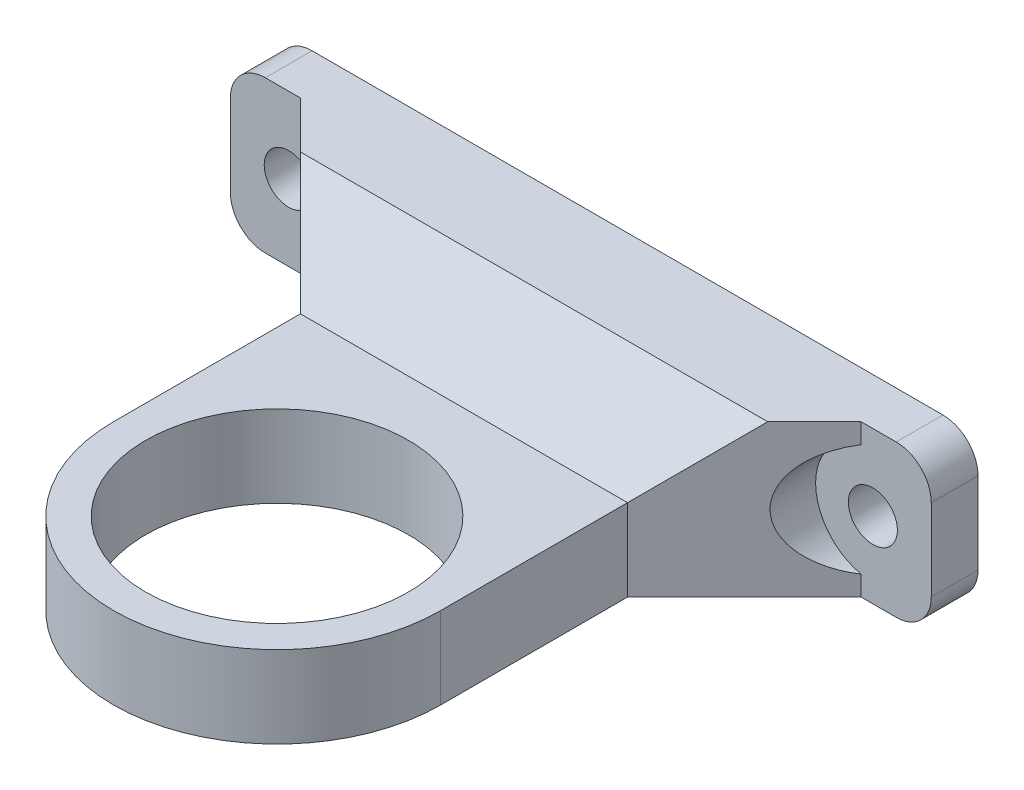
ISO-10303-21;
HEADER;
FILE_DESCRIPTION(('STEP AP214'),'2;1');
FILE_NAME('part.step','',(''),(''),'','','');
FILE_SCHEMA(('AUTOMOTIVE_DESIGN { 1 0 10303 214 1 1 1 1 }'));
ENDSEC;
DATA;
#1=APPLICATION_CONTEXT('core data for automotive mechanical design processes');
#2=APPLICATION_PROTOCOL_DEFINITION('international standard','automotive_design',2000,#1);
#3=PRODUCT_CONTEXT('',#1,'mechanical');
#4=PRODUCT('Part','Part','',(#3));
#5=PRODUCT_RELATED_PRODUCT_CATEGORY('part','',(#4));
#6=PRODUCT_DEFINITION_FORMATION('','',#4);
#7=PRODUCT_DEFINITION_CONTEXT('part definition',#1,'design');
#8=PRODUCT_DEFINITION('design','',#6,#7);
#9=PRODUCT_DEFINITION_SHAPE('','',#8);
#10=(LENGTH_UNIT() NAMED_UNIT(*) SI_UNIT(.MILLI.,.METRE.));
#11=(NAMED_UNIT(*) PLANE_ANGLE_UNIT() SI_UNIT($,.RADIAN.));
#12=(NAMED_UNIT(*) SI_UNIT($,.STERADIAN.) SOLID_ANGLE_UNIT());
#13=UNCERTAINTY_MEASURE_WITH_UNIT(LENGTH_MEASURE(1.E-05),#10,'distance_accuracy_value','');
#14=(GEOMETRIC_REPRESENTATION_CONTEXT(3) GLOBAL_UNCERTAINTY_ASSIGNED_CONTEXT((#13)) GLOBAL_UNIT_ASSIGNED_CONTEXT((#10,
#11,#12)) REPRESENTATION_CONTEXT('',''));
#15=CARTESIAN_POINT('',(0.,0.,0.));
#16=DIRECTION('',(0.,0.,1.));
#17=DIRECTION('',(1.,0.,0.));
#18=AXIS2_PLACEMENT_3D('',#15,#16,#17);
#19=CARTESIAN_POINT('',(25.,3.,-22.));
#20=DIRECTION('',(0.,0.,1.));
#21=DIRECTION('',(1.,0.,0.));
#22=AXIS2_PLACEMENT_3D('',#19,#20,#21);
#23=CYLINDRICAL_SURFACE('',#22,2.1);
#24=CARTESIAN_POINT('',(25.,3.,-22.));
#25=DIRECTION('',(0.,0.,-1.));
#26=DIRECTION('',(-1.,0.,0.));
#27=AXIS2_PLACEMENT_3D('',#24,#25,#26);
#28=CIRCLE('',#27,2.1);
#29=CARTESIAN_POINT('',(22.9,3.,-22.));
#30=VERTEX_POINT('',#29);
#31=EDGE_CURVE('E158',#30,#30,#28,.T.);
#32=ORIENTED_EDGE('',*,*,#31,.T.);
#33=EDGE_LOOP('',(#32));
#34=FACE_BOUND('',#33,.T.);
#35=CARTESIAN_POINT('',(25.,3.,-18.));
#36=DIRECTION('',(0.,0.,-1.));
#37=DIRECTION('',(-1.,0.,0.));
#38=AXIS2_PLACEMENT_3D('',#35,#36,#37);
#39=CIRCLE('',#38,2.1);
#40=CARTESIAN_POINT('',(22.9,3.,-18.));
#41=VERTEX_POINT('',#40);
#42=EDGE_CURVE('E305',#41,#41,#39,.F.);
#43=ORIENTED_EDGE('',*,*,#42,.T.);
#44=EDGE_LOOP('',(#43));
#45=FACE_BOUND('',#44,.T.);
#46=ADVANCED_FACE('F34',(#34,#45),#23,.F.);
#47=CARTESIAN_POINT('',(-14.,3.5,-7.99999999999993));
#48=DIRECTION('',(0.707106781186551,0.,-0.707106781186544));
#49=DIRECTION('',(0.,-1.,0.));
#50=AXIS2_PLACEMENT_3D('',#47,#48,#49);
#51=PLANE('',#50);
#52=CARTESIAN_POINT('',(-25.,3.,-19.0000000000001));
#53=DIRECTION('',(0.707106781186551,0.,-0.707106781186544));
#54=DIRECTION('',(-0.707106781186544,0.,-0.707106781186551));
#55=AXIS2_PLACEMENT_3D('',#52,#53,#54);
#56=ELLIPSE('',#55,6.9296464556282,4.9);
#57=CARTESIAN_POINT('',(-24.,-1.79687398208458,-18.));
#58=VERTEX_POINT('',#57);
#59=CARTESIAN_POINT('',(-24.,7.79687398208458,-18.));
#60=VERTEX_POINT('',#59);
#61=EDGE_CURVE('E168',#58,#60,#56,.F.);
#62=ORIENTED_EDGE('',*,*,#61,.F.);
#63=DIRECTION('',(0.,1.,0.));
#64=VECTOR('',#63,1.);
#65=CARTESIAN_POINT('',(-24.,3.5,-18.));
#66=LINE('',#65,#64);
#67=CARTESIAN_POINT('',(-24.,-3.5,-18.));
#68=VERTEX_POINT('',#67);
#69=EDGE_CURVE('E179',#68,#58,#66,.T.);
#70=ORIENTED_EDGE('',*,*,#69,.F.);
#71=DIRECTION('',(-0.707106781186544,0.,-0.707106781186551));
#72=VECTOR('',#71,1.);
#73=CARTESIAN_POINT('',(-3.0000000000001,-3.5,3.00000000000007));
#74=LINE('',#73,#72);
#75=CARTESIAN_POINT('',(-14.,-3.5,-7.99999999999993));
#76=VERTEX_POINT('',#75);
#77=EDGE_CURVE('E189',#76,#68,#74,.T.);
#78=ORIENTED_EDGE('',*,*,#77,.F.);
#79=DIRECTION('',(0.,-1.,0.));
#80=VECTOR('',#79,1.);
#81=CARTESIAN_POINT('',(-14.,3.5,-7.99999999999993));
#82=LINE('',#81,#80);
#83=CARTESIAN_POINT('',(-14.,3.5,-7.99999999999993));
#84=VERTEX_POINT('',#83);
#85=EDGE_CURVE('E181',#84,#76,#82,.T.);
#86=ORIENTED_EDGE('',*,*,#85,.F.);
#87=DIRECTION('',(-0.57735026918962,0.577350269189632,-0.577350269189626));
#88=VECTOR('',#87,1.);
#89=CARTESIAN_POINT('',(-14.,3.5,-7.99999999999993));
#90=LINE('',#89,#88);
#91=CARTESIAN_POINT('',(-19.9999999999999,9.5,-13.9999999999999));
#92=VERTEX_POINT('',#91);
#93=EDGE_CURVE('E201',#84,#92,#90,.T.);
#94=ORIENTED_EDGE('',*,*,#93,.T.);
#95=DIRECTION('',(0.707106781186544,0.,0.707106781186551));
#96=VECTOR('',#95,1.);
#97=CARTESIAN_POINT('',(-14.,9.5,-7.99999999999993));
#98=LINE('',#97,#96);
#99=CARTESIAN_POINT('',(-24.,9.5,-18.));
#100=VERTEX_POINT('',#99);
#101=EDGE_CURVE('E203',#100,#92,#98,.T.);
#102=ORIENTED_EDGE('',*,*,#101,.F.);
#103=EDGE_CURVE('E176',#60,#100,#66,.T.);
#104=ORIENTED_EDGE('',*,*,#103,.F.);
#105=EDGE_LOOP('',(#62,#70,#78,#86,#94,#102,#104));
#106=FACE_BOUND('',#105,.T.);
#107=ADVANCED_FACE('F353',(#106),#51,.F.);
#108=CARTESIAN_POINT('',(-25.,3.,-22.));
#109=DIRECTION('',(0.,0.,1.));
#110=DIRECTION('',(1.,0.,0.));
#111=AXIS2_PLACEMENT_3D('',#108,#109,#110);
#112=CYLINDRICAL_SURFACE('',#111,2.1);
#113=CARTESIAN_POINT('',(-25.,3.,-22.));
#114=DIRECTION('',(0.,0.,1.));
#115=DIRECTION('',(1.,0.,0.));
#116=AXIS2_PLACEMENT_3D('',#113,#114,#115);
#117=CIRCLE('',#116,2.1);
#118=CARTESIAN_POINT('',(-22.9,3.,-22.));
#119=VERTEX_POINT('',#118);
#120=EDGE_CURVE('E299',#119,#119,#117,.T.);
#121=ORIENTED_EDGE('',*,*,#120,.F.);
#122=EDGE_LOOP('',(#121));
#123=FACE_BOUND('',#122,.T.);
#124=CARTESIAN_POINT('',(-25.,3.,-18.));
#125=DIRECTION('',(0.,0.,-1.));
#126=DIRECTION('',(-1.,0.,0.));
#127=AXIS2_PLACEMENT_3D('',#124,#125,#126);
#128=CIRCLE('',#127,2.1);
#129=CARTESIAN_POINT('',(-27.1,3.,-18.));
#130=VERTEX_POINT('',#129);
#131=EDGE_CURVE('E296',#130,#130,#128,.T.);
#132=ORIENTED_EDGE('',*,*,#131,.F.);
#133=EDGE_LOOP('',(#132));
#134=FACE_BOUND('',#133,.T.);
#135=ADVANCED_FACE('F383',(#123,#134),#112,.F.);
#136=CARTESIAN_POINT('',(0.,3.5,-18.));
#137=DIRECTION('',(0.,0.,-1.));
#138=DIRECTION('',(-1.,0.,0.));
#139=AXIS2_PLACEMENT_3D('',#136,#137,#138);
#140=PLANE('',#139);
#141=DIRECTION('',(1.,0.,0.));
#142=VECTOR('',#141,1.);
#143=CARTESIAN_POINT('',(0.,-3.5,-18.));
#144=LINE('',#143,#142);
#145=CARTESIAN_POINT('',(24.0000000000001,-3.5,-18.));
#146=VERTEX_POINT('',#145);
#147=CARTESIAN_POINT('',(27.,-3.5,-18.));
#148=VERTEX_POINT('',#147);
#149=EDGE_CURVE('E271',#146,#148,#144,.T.);
#150=ORIENTED_EDGE('',*,*,#149,.T.);
#151=CARTESIAN_POINT('',(27.,-0.5,-18.));
#152=DIRECTION('',(0.,0.,-1.));
#153=DIRECTION('',(-1.,0.,0.));
#154=AXIS2_PLACEMENT_3D('',#151,#152,#153);
#155=CIRCLE('',#154,3.);
#156=CARTESIAN_POINT('',(30.,-0.5,-18.));
#157=VERTEX_POINT('',#156);
#158=EDGE_CURVE('E215',#148,#157,#155,.F.);
#159=ORIENTED_EDGE('',*,*,#158,.T.);
#160=DIRECTION('',(0.,-1.,0.));
#161=VECTOR('',#160,1.);
#162=CARTESIAN_POINT('',(30.,3.5,-18.));
#163=LINE('',#162,#161);
#164=CARTESIAN_POINT('',(30.,6.5,-18.));
#165=VERTEX_POINT('',#164);
#166=EDGE_CURVE('E256',#165,#157,#163,.T.);
#167=ORIENTED_EDGE('',*,*,#166,.F.);
#168=CARTESIAN_POINT('',(27.,6.5,-18.));
#169=DIRECTION('',(0.,0.,-1.));
#170=DIRECTION('',(-1.,0.,0.));
#171=AXIS2_PLACEMENT_3D('',#168,#169,#170);
#172=CIRCLE('',#171,3.);
#173=CARTESIAN_POINT('',(27.,9.5,-18.));
#174=VERTEX_POINT('',#173);
#175=EDGE_CURVE('E213',#165,#174,#172,.F.);
#176=ORIENTED_EDGE('',*,*,#175,.T.);
#177=DIRECTION('',(1.,0.,0.));
#178=VECTOR('',#177,1.);
#179=CARTESIAN_POINT('',(-30.,9.5,-18.));
#180=LINE('',#179,#178);
#181=CARTESIAN_POINT('',(24.0000000000001,9.5,-18.));
#182=VERTEX_POINT('',#181);
#183=EDGE_CURVE('E175',#182,#174,#180,.T.);
#184=ORIENTED_EDGE('',*,*,#183,.F.);
#185=DIRECTION('',(0.,-1.,0.));
#186=VECTOR('',#185,1.);
#187=CARTESIAN_POINT('',(24.0000000000001,-3.5,-18.));
#188=LINE('',#187,#186);
#189=CARTESIAN_POINT('',(24.0000000000001,7.7968739820846,-18.));
#190=VERTEX_POINT('',#189);
#191=EDGE_CURVE('E163',#182,#190,#188,.T.);
#192=ORIENTED_EDGE('',*,*,#191,.T.);
#193=CARTESIAN_POINT('',(25.,3.,-18.));
#194=DIRECTION('',(0.,0.,-1.));
#195=DIRECTION('',(-1.,0.,0.));
#196=AXIS2_PLACEMENT_3D('',#193,#194,#195);
#197=CIRCLE('',#196,4.9);
#198=CARTESIAN_POINT('',(24.0000000000001,-1.7968739820846,-18.));
#199=VERTEX_POINT('',#198);
#200=EDGE_CURVE('E151',#199,#190,#197,.T.);
#201=ORIENTED_EDGE('',*,*,#200,.F.);
#202=EDGE_CURVE('E166',#199,#146,#188,.T.);
#203=ORIENTED_EDGE('',*,*,#202,.T.);
#204=EDGE_LOOP('',(#150,#159,#167,#176,#184,#192,#201,#203));
#205=FACE_BOUND('',#204,.T.);
#206=ORIENTED_EDGE('',*,*,#42,.F.);
#207=EDGE_LOOP('',(#206));
#208=FACE_BOUND('',#207,.T.);
#209=ADVANCED_FACE('F172',(#205,#208),#140,.F.);
#210=CARTESIAN_POINT('',(-30.,3.5,0.));
#211=DIRECTION('',(1.,0.,0.));
#212=DIRECTION('',(0.,0.,-1.));
#213=AXIS2_PLACEMENT_3D('',#210,#211,#212);
#214=PLANE('',#213);
#215=DIRECTION('',(0.,-1.,0.));
#216=VECTOR('',#215,1.);
#217=CARTESIAN_POINT('',(-30.,3.5,-22.));
#218=LINE('',#217,#216);
#219=CARTESIAN_POINT('',(-30.,6.5,-22.));
#220=VERTEX_POINT('',#219);
#221=CARTESIAN_POINT('',(-30.,-0.5,-22.));
#222=VERTEX_POINT('',#221);
#223=EDGE_CURVE('E244',#220,#222,#218,.T.);
#224=ORIENTED_EDGE('',*,*,#223,.T.);
#225=DIRECTION('',(0.,0.,1.));
#226=VECTOR('',#225,1.);
#227=CARTESIAN_POINT('',(-30.,-0.5,0.));
#228=LINE('',#227,#226);
#229=CARTESIAN_POINT('',(-30.,-0.5,-18.));
#230=VERTEX_POINT('',#229);
#231=EDGE_CURVE('E237',#222,#230,#228,.T.);
#232=ORIENTED_EDGE('',*,*,#231,.T.);
#233=DIRECTION('',(0.,-1.,0.));
#234=VECTOR('',#233,1.);
#235=CARTESIAN_POINT('',(-30.,3.5,-18.));
#236=LINE('',#235,#234);
#237=CARTESIAN_POINT('',(-30.,6.5,-18.));
#238=VERTEX_POINT('',#237);
#239=EDGE_CURVE('E241',#238,#230,#236,.T.);
#240=ORIENTED_EDGE('',*,*,#239,.F.);
#241=DIRECTION('',(0.,0.,1.));
#242=VECTOR('',#241,1.);
#243=CARTESIAN_POINT('',(-30.,6.5,-22.));
#244=LINE('',#243,#242);
#245=EDGE_CURVE('E235',#238,#220,#244,.F.);
#246=ORIENTED_EDGE('',*,*,#245,.T.);
#247=EDGE_LOOP('',(#224,#232,#240,#246));
#248=FACE_BOUND('',#247,.T.);
#249=ADVANCED_FACE('F240',(#248),#214,.F.);
#250=CARTESIAN_POINT('',(-14.,3.5,0.));
#251=DIRECTION('',(-1.,0.,0.));
#252=DIRECTION('',(0.,0.,1.));
#253=AXIS2_PLACEMENT_3D('',#250,#251,#252);
#254=PLANE('',#253);
#255=DIRECTION('',(0.,0.,-1.));
#256=VECTOR('',#255,1.);
#257=CARTESIAN_POINT('',(-14.,3.5,0.));
#258=LINE('',#257,#256);
#259=CARTESIAN_POINT('',(-14.,3.5,7.99999999999999));
#260=VERTEX_POINT('',#259);
#261=EDGE_CURVE('E267',#260,#84,#258,.T.);
#262=ORIENTED_EDGE('',*,*,#261,.T.);
#263=ORIENTED_EDGE('',*,*,#85,.T.);
#264=DIRECTION('',(0.,0.,-1.));
#265=VECTOR('',#264,1.);
#266=CARTESIAN_POINT('',(-14.,-3.5,0.));
#267=LINE('',#266,#265);
#268=CARTESIAN_POINT('',(-14.,-3.5,7.99999999999999));
#269=VERTEX_POINT('',#268);
#270=EDGE_CURVE('E277',#269,#76,#267,.T.);
#271=ORIENTED_EDGE('',*,*,#270,.F.);
#272=DIRECTION('',(0.,-1.,0.));
#273=VECTOR('',#272,1.);
#274=CARTESIAN_POINT('',(-14.,3.5,7.99999999999999));
#275=LINE('',#274,#273);
#276=EDGE_CURVE('E249',#260,#269,#275,.T.);
#277=ORIENTED_EDGE('',*,*,#276,.F.);
#278=EDGE_LOOP('',(#262,#263,#271,#277));
#279=FACE_BOUND('',#278,.T.);
#280=ADVANCED_FACE('F349',(#279),#254,.T.);
#281=CARTESIAN_POINT('',(0.,3.5,7.99999999999999));
#282=DIRECTION('',(0.,-1.,0.));
#283=DIRECTION('',(0.,0.,-1.));
#284=AXIS2_PLACEMENT_3D('',#281,#282,#283);
#285=CYLINDRICAL_SURFACE('',#284,14.);
#286=CARTESIAN_POINT('',(0.,-3.5,7.99999999999999));
#287=DIRECTION('',(0.,1.,0.));
#288=DIRECTION('',(0.,0.,1.));
#289=AXIS2_PLACEMENT_3D('',#286,#287,#288);
#290=CIRCLE('',#289,14.);
#291=CARTESIAN_POINT('',(14.,-3.5,7.99999999999999));
#292=VERTEX_POINT('',#291);
#293=EDGE_CURVE('E275',#269,#292,#290,.T.);
#294=ORIENTED_EDGE('',*,*,#293,.T.);
#295=DIRECTION('',(0.,-1.,0.));
#296=VECTOR('',#295,1.);
#297=CARTESIAN_POINT('',(14.,3.5,7.99999999999999));
#298=LINE('',#297,#296);
#299=CARTESIAN_POINT('',(14.,3.5,7.99999999999999));
#300=VERTEX_POINT('',#299);
#301=EDGE_CURVE('E251',#300,#292,#298,.T.);
#302=ORIENTED_EDGE('',*,*,#301,.F.);
#303=CARTESIAN_POINT('',(0.,3.5,7.99999999999999));
#304=DIRECTION('',(0.,1.,0.));
#305=DIRECTION('',(0.,0.,1.));
#306=AXIS2_PLACEMENT_3D('',#303,#304,#305);
#307=CIRCLE('',#306,14.);
#308=EDGE_CURVE('E288',#260,#300,#307,.T.);
#309=ORIENTED_EDGE('',*,*,#308,.F.);
#310=ORIENTED_EDGE('',*,*,#276,.T.);
#311=EDGE_LOOP('',(#294,#302,#309,#310));
#312=FACE_BOUND('',#311,.T.);
#313=ADVANCED_FACE('F345',(#312),#285,.T.);
#314=CARTESIAN_POINT('',(14.,3.5,0.));
#315=DIRECTION('',(-1.,0.,0.));
#316=DIRECTION('',(0.,0.,1.));
#317=AXIS2_PLACEMENT_3D('',#314,#315,#316);
#318=PLANE('',#317);
#319=DIRECTION('',(0.,0.,-1.));
#320=VECTOR('',#319,1.);
#321=CARTESIAN_POINT('',(14.,-3.5,0.));
#322=LINE('',#321,#320);
#323=CARTESIAN_POINT('',(14.,-3.5,-8.00000000000002));
#324=VERTEX_POINT('',#323);
#325=EDGE_CURVE('E272',#292,#324,#322,.T.);
#326=ORIENTED_EDGE('',*,*,#325,.T.);
#327=DIRECTION('',(0.,1.,0.));
#328=VECTOR('',#327,1.);
#329=CARTESIAN_POINT('',(14.,3.5,-8.00000000000002));
#330=LINE('',#329,#328);
#331=CARTESIAN_POINT('',(14.,3.5,-8.00000000000002));
#332=VERTEX_POINT('',#331);
#333=EDGE_CURVE('E186',#324,#332,#330,.T.);
#334=ORIENTED_EDGE('',*,*,#333,.T.);
#335=DIRECTION('',(0.,0.,-1.));
#336=VECTOR('',#335,1.);
#337=CARTESIAN_POINT('',(14.,3.5,0.));
#338=LINE('',#337,#336);
#339=EDGE_CURVE('E285',#300,#332,#338,.T.);
#340=ORIENTED_EDGE('',*,*,#339,.F.);
#341=ORIENTED_EDGE('',*,*,#301,.T.);
#342=EDGE_LOOP('',(#326,#334,#340,#341));
#343=FACE_BOUND('',#342,.T.);
#344=ADVANCED_FACE('F340',(#343),#318,.F.);
#345=ORIENTED_EDGE('',*,*,#239,.T.);
#346=CARTESIAN_POINT('',(-27.,-0.5,-18.));
#347=DIRECTION('',(0.,0.,-1.));
#348=DIRECTION('',(-1.,0.,0.));
#349=AXIS2_PLACEMENT_3D('',#346,#347,#348);
#350=CIRCLE('',#349,3.);
#351=CARTESIAN_POINT('',(-27.,-3.5,-18.));
#352=VERTEX_POINT('',#351);
#353=EDGE_CURVE('E11',#230,#352,#350,.F.);
#354=ORIENTED_EDGE('',*,*,#353,.T.);
#355=EDGE_CURVE('E280',#352,#68,#144,.T.);
#356=ORIENTED_EDGE('',*,*,#355,.T.);
#357=ORIENTED_EDGE('',*,*,#69,.T.);
#358=CARTESIAN_POINT('',(-25.,3.,-18.));
#359=DIRECTION('',(0.,0.,1.));
#360=DIRECTION('',(1.,0.,0.));
#361=AXIS2_PLACEMENT_3D('',#358,#359,#360);
#362=CIRCLE('',#361,4.9);
#363=EDGE_CURVE('E302',#58,#60,#362,.T.);
#364=ORIENTED_EDGE('',*,*,#363,.T.);
#365=ORIENTED_EDGE('',*,*,#103,.T.);
#366=CARTESIAN_POINT('',(-27.,9.5,-18.));
#367=VERTEX_POINT('',#366);
#368=EDGE_CURVE('E294',#367,#100,#180,.T.);
#369=ORIENTED_EDGE('',*,*,#368,.F.);
#370=CARTESIAN_POINT('',(-27.,6.5,-18.));
#371=DIRECTION('',(0.,0.,-1.));
#372=DIRECTION('',(-1.,0.,0.));
#373=AXIS2_PLACEMENT_3D('',#370,#371,#372);
#374=CIRCLE('',#373,3.);
#375=EDGE_CURVE('E42',#367,#238,#374,.F.);
#376=ORIENTED_EDGE('',*,*,#375,.T.);
#377=EDGE_LOOP('',(#345,#354,#356,#357,#364,#365,#369,#376));
#378=FACE_BOUND('',#377,.T.);
#379=ORIENTED_EDGE('',*,*,#131,.T.);
#380=EDGE_LOOP('',(#379));
#381=FACE_BOUND('',#380,.T.);
#382=ADVANCED_FACE('F246',(#378,#381),#140,.F.);
#383=CARTESIAN_POINT('',(30.,3.5,0.));
#384=DIRECTION('',(1.,0.,0.));
#385=DIRECTION('',(0.,0.,-1.));
#386=AXIS2_PLACEMENT_3D('',#383,#384,#385);
#387=PLANE('',#386);
#388=ORIENTED_EDGE('',*,*,#166,.T.);
#389=DIRECTION('',(0.,0.,1.));
#390=VECTOR('',#389,1.);
#391=CARTESIAN_POINT('',(30.,-0.5,-22.));
#392=LINE('',#391,#390);
#393=CARTESIAN_POINT('',(30.,-0.5,-22.));
#394=VERTEX_POINT('',#393);
#395=EDGE_CURVE('E219',#157,#394,#392,.F.);
#396=ORIENTED_EDGE('',*,*,#395,.T.);
#397=DIRECTION('',(0.,-1.,0.));
#398=VECTOR('',#397,1.);
#399=CARTESIAN_POINT('',(30.,3.5,-22.));
#400=LINE('',#399,#398);
#401=CARTESIAN_POINT('',(30.,6.5,-22.));
#402=VERTEX_POINT('',#401);
#403=EDGE_CURVE('E259',#402,#394,#400,.T.);
#404=ORIENTED_EDGE('',*,*,#403,.F.);
#405=DIRECTION('',(0.,0.,-1.));
#406=VECTOR('',#405,1.);
#407=CARTESIAN_POINT('',(30.,6.5,0.));
#408=LINE('',#407,#406);
#409=EDGE_CURVE('E217',#402,#165,#408,.F.);
#410=ORIENTED_EDGE('',*,*,#409,.T.);
#411=EDGE_LOOP('',(#388,#396,#404,#410));
#412=FACE_BOUND('',#411,.T.);
#413=ADVANCED_FACE('F317',(#412),#387,.T.);
#414=CARTESIAN_POINT('',(0.,3.5,-22.));
#415=DIRECTION('',(0.,0.,-1.));
#416=DIRECTION('',(-1.,0.,0.));
#417=AXIS2_PLACEMENT_3D('',#414,#415,#416);
#418=PLANE('',#417);
#419=ORIENTED_EDGE('',*,*,#31,.F.);
#420=EDGE_LOOP('',(#419));
#421=FACE_BOUND('',#420,.T.);
#422=ORIENTED_EDGE('',*,*,#120,.T.);
#423=EDGE_LOOP('',(#422));
#424=FACE_BOUND('',#423,.T.);
#425=ORIENTED_EDGE('',*,*,#403,.T.);
#426=CARTESIAN_POINT('',(27.,-0.5,-22.));
#427=DIRECTION('',(0.,0.,-1.));
#428=DIRECTION('',(-1.,0.,0.));
#429=AXIS2_PLACEMENT_3D('',#426,#427,#428);
#430=CIRCLE('',#429,3.);
#431=CARTESIAN_POINT('',(27.,-3.5,-22.));
#432=VERTEX_POINT('',#431);
#433=EDGE_CURVE('E227',#394,#432,#430,.T.);
#434=ORIENTED_EDGE('',*,*,#433,.T.);
#435=DIRECTION('',(1.,0.,0.));
#436=VECTOR('',#435,1.);
#437=CARTESIAN_POINT('',(0.,-3.5,-22.));
#438=LINE('',#437,#436);
#439=CARTESIAN_POINT('',(-27.,-3.5,-22.));
#440=VERTEX_POINT('',#439);
#441=EDGE_CURVE('E268',#440,#432,#438,.T.);
#442=ORIENTED_EDGE('',*,*,#441,.F.);
#443=CARTESIAN_POINT('',(-27.,-0.5,-22.));
#444=DIRECTION('',(0.,0.,-1.));
#445=DIRECTION('',(-1.,0.,0.));
#446=AXIS2_PLACEMENT_3D('',#443,#444,#445);
#447=CIRCLE('',#446,3.);
#448=EDGE_CURVE('E223',#440,#222,#447,.T.);
#449=ORIENTED_EDGE('',*,*,#448,.T.);
#450=ORIENTED_EDGE('',*,*,#223,.F.);
#451=CARTESIAN_POINT('',(-27.,6.5,-22.));
#452=DIRECTION('',(0.,0.,-1.));
#453=DIRECTION('',(-1.,0.,0.));
#454=AXIS2_PLACEMENT_3D('',#451,#452,#453);
#455=CIRCLE('',#454,3.);
#456=CARTESIAN_POINT('',(-27.,9.5,-22.));
#457=VERTEX_POINT('',#456);
#458=EDGE_CURVE('E221',#220,#457,#455,.T.);
#459=ORIENTED_EDGE('',*,*,#458,.T.);
#460=DIRECTION('',(-1.,0.,0.));
#461=VECTOR('',#460,1.);
#462=CARTESIAN_POINT('',(-30.,9.5,-22.));
#463=LINE('',#462,#461);
#464=CARTESIAN_POINT('',(27.,9.5,-22.));
#465=VERTEX_POINT('',#464);
#466=EDGE_CURVE('E282',#465,#457,#463,.T.);
#467=ORIENTED_EDGE('',*,*,#466,.F.);
#468=CARTESIAN_POINT('',(27.,6.5,-22.));
#469=DIRECTION('',(0.,0.,-1.));
#470=DIRECTION('',(-1.,0.,0.));
#471=AXIS2_PLACEMENT_3D('',#468,#469,#470);
#472=CIRCLE('',#471,3.);
#473=EDGE_CURVE('E225',#465,#402,#472,.T.);
#474=ORIENTED_EDGE('',*,*,#473,.T.);
#475=EDGE_LOOP('',(#425,#434,#442,#449,#450,#459,#467,#474));
#476=FACE_BOUND('',#475,.T.);
#477=ADVANCED_FACE('F313',(#421,#424,#476),#418,.T.);
#478=CARTESIAN_POINT('',(0.,3.5,7.99999999999999));
#479=DIRECTION('',(0.,-1.,0.));
#480=DIRECTION('',(0.,0.,-1.));
#481=AXIS2_PLACEMENT_3D('',#478,#479,#480);
#482=CYLINDRICAL_SURFACE('',#481,11.25);
#483=CARTESIAN_POINT('',(0.,3.5,7.99999999999999));
#484=DIRECTION('',(0.,1.,0.));
#485=DIRECTION('',(0.,0.,1.));
#486=AXIS2_PLACEMENT_3D('',#483,#484,#485);
#487=CIRCLE('',#486,11.25);
#488=CARTESIAN_POINT('',(0.,3.5,19.25));
#489=VERTEX_POINT('',#488);
#490=EDGE_CURVE('E263',#489,#489,#487,.T.);
#491=ORIENTED_EDGE('',*,*,#490,.T.);
#492=EDGE_LOOP('',(#491));
#493=FACE_BOUND('',#492,.T.);
#494=CARTESIAN_POINT('',(0.,-3.5,7.99999999999999));
#495=DIRECTION('',(0.,1.,0.));
#496=DIRECTION('',(0.,0.,1.));
#497=AXIS2_PLACEMENT_3D('',#494,#495,#496);
#498=CIRCLE('',#497,11.25);
#499=CARTESIAN_POINT('',(0.,-3.5,19.25));
#500=VERTEX_POINT('',#499);
#501=EDGE_CURVE('E264',#500,#500,#498,.T.);
#502=ORIENTED_EDGE('',*,*,#501,.F.);
#503=EDGE_LOOP('',(#502));
#504=FACE_BOUND('',#503,.T.);
#505=ADVANCED_FACE('F316',(#493,#504),#482,.F.);
#506=CARTESIAN_POINT('',(0.,3.5,0.));
#507=DIRECTION('',(0.,1.,0.));
#508=DIRECTION('',(0.,0.,1.));
#509=AXIS2_PLACEMENT_3D('',#506,#507,#508);
#510=PLANE('',#509);
#511=ORIENTED_EDGE('',*,*,#339,.T.);
#512=DIRECTION('',(-1.,0.,0.));
#513=VECTOR('',#512,1.);
#514=CARTESIAN_POINT('',(0.,3.5,-7.99999999999994));
#515=LINE('',#514,#513);
#516=EDGE_CURVE('E194',#332,#84,#515,.T.);
#517=ORIENTED_EDGE('',*,*,#516,.T.);
#518=ORIENTED_EDGE('',*,*,#261,.F.);
#519=ORIENTED_EDGE('',*,*,#308,.T.);
#520=EDGE_LOOP('',(#511,#517,#518,#519));
#521=FACE_BOUND('',#520,.T.);
#522=ORIENTED_EDGE('',*,*,#490,.F.);
#523=EDGE_LOOP('',(#522));
#524=FACE_BOUND('',#523,.T.);
#525=ADVANCED_FACE('F396',(#521,#524),#510,.T.);
#526=CARTESIAN_POINT('',(0.,-3.5,0.));
#527=DIRECTION('',(0.,1.,0.));
#528=DIRECTION('',(0.,0.,1.));
#529=AXIS2_PLACEMENT_3D('',#526,#527,#528);
#530=PLANE('',#529);
#531=ORIENTED_EDGE('',*,*,#441,.T.);
#532=DIRECTION('',(0.,0.,1.));
#533=VECTOR('',#532,1.);
#534=CARTESIAN_POINT('',(27.,-3.5,-18.));
#535=LINE('',#534,#533);
#536=EDGE_CURVE('E210',#432,#148,#535,.T.);
#537=ORIENTED_EDGE('',*,*,#536,.T.);
#538=ORIENTED_EDGE('',*,*,#149,.F.);
#539=DIRECTION('',(0.707106781186551,0.,-0.707106781186544));
#540=VECTOR('',#539,1.);
#541=CARTESIAN_POINT('',(2.99999999999992,-3.5,2.99999999999995));
#542=LINE('',#541,#540);
#543=EDGE_CURVE('E192',#146,#324,#542,.F.);
#544=ORIENTED_EDGE('',*,*,#543,.T.);
#545=ORIENTED_EDGE('',*,*,#325,.F.);
#546=ORIENTED_EDGE('',*,*,#293,.F.);
#547=ORIENTED_EDGE('',*,*,#270,.T.);
#548=ORIENTED_EDGE('',*,*,#77,.T.);
#549=ORIENTED_EDGE('',*,*,#355,.F.);
#550=DIRECTION('',(0.,0.,1.));
#551=VECTOR('',#550,1.);
#552=CARTESIAN_POINT('',(-27.,-3.5,0.));
#553=LINE('',#552,#551);
#554=EDGE_CURVE('E167',#352,#440,#553,.F.);
#555=ORIENTED_EDGE('',*,*,#554,.T.);
#556=EDGE_LOOP('',(#531,#537,#538,#544,#545,#546,#547,#548,#549,#555));
#557=FACE_BOUND('',#556,.T.);
#558=ORIENTED_EDGE('',*,*,#501,.T.);
#559=EDGE_LOOP('',(#558));
#560=FACE_BOUND('',#559,.T.);
#561=ADVANCED_FACE('F333',(#557,#560),#530,.F.);
#562=CARTESIAN_POINT('',(0.,9.5,0.));
#563=DIRECTION('',(0.,1.,0.));
#564=DIRECTION('',(0.,0.,1.));
#565=AXIS2_PLACEMENT_3D('',#562,#563,#564);
#566=PLANE('',#565);
#567=ORIENTED_EDGE('',*,*,#183,.T.);
#568=DIRECTION('',(0.,0.,-1.));
#569=VECTOR('',#568,1.);
#570=CARTESIAN_POINT('',(27.,9.5,0.));
#571=LINE('',#570,#569);
#572=EDGE_CURVE('E232',#174,#465,#571,.T.);
#573=ORIENTED_EDGE('',*,*,#572,.T.);
#574=ORIENTED_EDGE('',*,*,#466,.T.);
#575=DIRECTION('',(0.,0.,1.));
#576=VECTOR('',#575,1.);
#577=CARTESIAN_POINT('',(-27.,9.5,-18.));
#578=LINE('',#577,#576);
#579=EDGE_CURVE('E229',#457,#367,#578,.T.);
#580=ORIENTED_EDGE('',*,*,#579,.T.);
#581=ORIENTED_EDGE('',*,*,#368,.T.);
#582=ORIENTED_EDGE('',*,*,#101,.T.);
#583=DIRECTION('',(1.,0.,0.));
#584=VECTOR('',#583,1.);
#585=CARTESIAN_POINT('',(0.,9.5,-13.9999999999999));
#586=LINE('',#585,#584);
#587=CARTESIAN_POINT('',(19.9999999999999,9.5,-13.9999999999999));
#588=VERTEX_POINT('',#587);
#589=EDGE_CURVE('E197',#92,#588,#586,.T.);
#590=ORIENTED_EDGE('',*,*,#589,.T.);
#591=DIRECTION('',(-0.707106781186551,0.,0.707106781186544));
#592=VECTOR('',#591,1.);
#593=CARTESIAN_POINT('',(24.0000000000001,9.5,-18.));
#594=LINE('',#593,#592);
#595=EDGE_CURVE('E204',#182,#588,#594,.T.);
#596=ORIENTED_EDGE('',*,*,#595,.F.);
#597=EDGE_LOOP('',(#567,#573,#574,#580,#581,#582,#590,#596));
#598=FACE_BOUND('',#597,.T.);
#599=ADVANCED_FACE('F361',(#598),#566,.T.);
#600=CARTESIAN_POINT('',(24.0000000000001,3.5,-18.));
#601=DIRECTION('',(0.707106781186544,0.,0.707106781186551));
#602=DIRECTION('',(0.,1.,0.));
#603=AXIS2_PLACEMENT_3D('',#600,#601,#602);
#604=PLANE('',#603);
#605=ORIENTED_EDGE('',*,*,#202,.F.);
#606=CARTESIAN_POINT('',(25.,3.,-18.9999999999999));
#607=DIRECTION('',(0.707106781186544,0.,0.707106781186551));
#608=DIRECTION('',(0.707106781186551,0.,-0.707106781186544));
#609=AXIS2_PLACEMENT_3D('',#606,#607,#608);
#610=ELLIPSE('',#609,6.92964645562814,4.9);
#611=EDGE_CURVE('E154',#199,#190,#610,.F.);
#612=ORIENTED_EDGE('',*,*,#611,.T.);
#613=ORIENTED_EDGE('',*,*,#191,.F.);
#614=ORIENTED_EDGE('',*,*,#595,.T.);
#615=DIRECTION('',(0.577350269189627,0.577350269189628,-0.577350269189622));
#616=VECTOR('',#615,1.);
#617=CARTESIAN_POINT('',(20.6666666666667,10.1666666666668,-14.6666666666666));
#618=LINE('',#617,#616);
#619=EDGE_CURVE('E199',#588,#332,#618,.F.);
#620=ORIENTED_EDGE('',*,*,#619,.T.);
#621=ORIENTED_EDGE('',*,*,#333,.F.);
#622=ORIENTED_EDGE('',*,*,#543,.F.);
#623=EDGE_LOOP('',(#605,#612,#613,#614,#620,#621,#622));
#624=FACE_BOUND('',#623,.T.);
#625=ADVANCED_FACE('F161',(#624),#604,.T.);
#626=CARTESIAN_POINT('',(0.,13.5000000000002,-18.));
#627=DIRECTION('',(0.,-0.707106781186544,-0.707106781186551));
#628=DIRECTION('',(1.,0.,0.));
#629=AXIS2_PLACEMENT_3D('',#626,#627,#628);
#630=PLANE('',#629);
#631=ORIENTED_EDGE('',*,*,#93,.F.);
#632=ORIENTED_EDGE('',*,*,#516,.F.);
#633=ORIENTED_EDGE('',*,*,#619,.F.);
#634=ORIENTED_EDGE('',*,*,#589,.F.);
#635=EDGE_LOOP('',(#631,#632,#633,#634));
#636=FACE_BOUND('',#635,.T.);
#637=ADVANCED_FACE('F366',(#636),#630,.F.);
#638=CARTESIAN_POINT('',(-25.,3.,22.));
#639=DIRECTION('',(0.,0.,-1.));
#640=DIRECTION('',(-1.,0.,0.));
#641=AXIS2_PLACEMENT_3D('',#638,#639,#640);
#642=CYLINDRICAL_SURFACE('',#641,4.9);
#643=ORIENTED_EDGE('',*,*,#61,.T.);
#644=ORIENTED_EDGE('',*,*,#363,.F.);
#645=EDGE_LOOP('',(#643,#644));
#646=FACE_BOUND('',#645,.T.);
#647=ADVANCED_FACE('F387',(#646),#642,.F.);
#648=CARTESIAN_POINT('',(25.,3.,22.));
#649=DIRECTION('',(0.,0.,-1.));
#650=DIRECTION('',(-1.,0.,0.));
#651=AXIS2_PLACEMENT_3D('',#648,#649,#650);
#652=CYLINDRICAL_SURFACE('',#651,4.9);
#653=ORIENTED_EDGE('',*,*,#200,.T.);
#654=ORIENTED_EDGE('',*,*,#611,.F.);
#655=EDGE_LOOP('',(#653,#654));
#656=FACE_BOUND('',#655,.T.);
#657=ADVANCED_FACE('F153',(#656),#652,.F.);
#658=CARTESIAN_POINT('',(27.,-0.5,0.));
#659=DIRECTION('',(0.,0.,-1.));
#660=DIRECTION('',(-1.,0.,0.));
#661=AXIS2_PLACEMENT_3D('',#658,#659,#660);
#662=CYLINDRICAL_SURFACE('',#661,3.);
#663=ORIENTED_EDGE('',*,*,#433,.F.);
#664=ORIENTED_EDGE('',*,*,#395,.F.);
#665=ORIENTED_EDGE('',*,*,#158,.F.);
#666=ORIENTED_EDGE('',*,*,#536,.F.);
#667=EDGE_LOOP('',(#663,#664,#665,#666));
#668=FACE_BOUND('',#667,.T.);
#669=ADVANCED_FACE('F330',(#668),#662,.T.);
#670=CARTESIAN_POINT('',(27.,6.5,0.));
#671=DIRECTION('',(0.,0.,-1.));
#672=DIRECTION('',(-1.,0.,0.));
#673=AXIS2_PLACEMENT_3D('',#670,#671,#672);
#674=CYLINDRICAL_SURFACE('',#673,3.);
#675=ORIENTED_EDGE('',*,*,#175,.F.);
#676=ORIENTED_EDGE('',*,*,#409,.F.);
#677=ORIENTED_EDGE('',*,*,#473,.F.);
#678=ORIENTED_EDGE('',*,*,#572,.F.);
#679=EDGE_LOOP('',(#675,#676,#677,#678));
#680=FACE_BOUND('',#679,.T.);
#681=ADVANCED_FACE('F371',(#680),#674,.T.);
#682=CARTESIAN_POINT('',(-27.,-0.5,0.));
#683=DIRECTION('',(0.,0.,1.));
#684=DIRECTION('',(1.,0.,0.));
#685=AXIS2_PLACEMENT_3D('',#682,#683,#684);
#686=CYLINDRICAL_SURFACE('',#685,3.);
#687=ORIENTED_EDGE('',*,*,#448,.F.);
#688=ORIENTED_EDGE('',*,*,#554,.F.);
#689=ORIENTED_EDGE('',*,*,#353,.F.);
#690=ORIENTED_EDGE('',*,*,#231,.F.);
#691=EDGE_LOOP('',(#687,#688,#689,#690));
#692=FACE_BOUND('',#691,.T.);
#693=ADVANCED_FACE('F356',(#692),#686,.T.);
#694=CARTESIAN_POINT('',(-27.,6.5,0.));
#695=DIRECTION('',(0.,0.,-1.));
#696=DIRECTION('',(-1.,0.,0.));
#697=AXIS2_PLACEMENT_3D('',#694,#695,#696);
#698=CYLINDRICAL_SURFACE('',#697,3.);
#699=ORIENTED_EDGE('',*,*,#458,.F.);
#700=ORIENTED_EDGE('',*,*,#245,.F.);
#701=ORIENTED_EDGE('',*,*,#375,.F.);
#702=ORIENTED_EDGE('',*,*,#579,.F.);
#703=EDGE_LOOP('',(#699,#700,#701,#702));
#704=FACE_BOUND('',#703,.T.);
#705=ADVANCED_FACE('F36',(#704),#698,.T.);
#706=CLOSED_SHELL('',(#46,#107,#135,#209,#249,#280,#313,#344,#382,#413,#477,#505,#525,#561,#599,
#625,#637,#647,#657,#669,#681,#693,#705));
#707=MANIFOLD_SOLID_BREP('B2',#706);
#708=ADVANCED_BREP_SHAPE_REPRESENTATION('',(#18,#707),#14);
#709=SHAPE_DEFINITION_REPRESENTATION(#9,#708);
ENDSEC;
END-ISO-10303-21;
